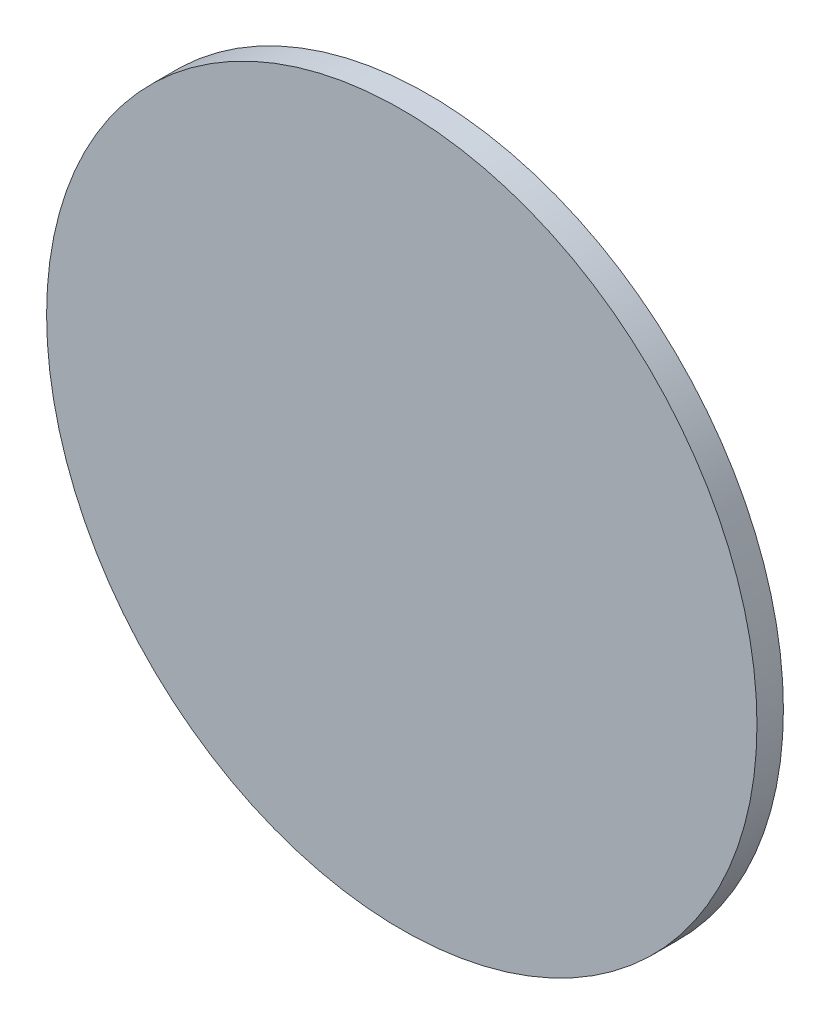
ISO-10303-21;
HEADER;
FILE_DESCRIPTION(('STEP AP214'),'2;1');
FILE_NAME('part.step','',(''),(''),'','','');
FILE_SCHEMA(('AUTOMOTIVE_DESIGN { 1 0 10303 214 1 1 1 1 }'));
ENDSEC;
DATA;
#1=APPLICATION_CONTEXT('core data for automotive mechanical design processes');
#2=APPLICATION_PROTOCOL_DEFINITION('international standard','automotive_design',2000,#1);
#3=PRODUCT_CONTEXT('',#1,'mechanical');
#4=PRODUCT('Part','Part','',(#3));
#5=PRODUCT_RELATED_PRODUCT_CATEGORY('part','',(#4));
#6=PRODUCT_DEFINITION_FORMATION('','',#4);
#7=PRODUCT_DEFINITION_CONTEXT('part definition',#1,'design');
#8=PRODUCT_DEFINITION('design','',#6,#7);
#9=PRODUCT_DEFINITION_SHAPE('','',#8);
#10=(LENGTH_UNIT() NAMED_UNIT(*) SI_UNIT(.MILLI.,.METRE.));
#11=(NAMED_UNIT(*) PLANE_ANGLE_UNIT() SI_UNIT($,.RADIAN.));
#12=(NAMED_UNIT(*) SI_UNIT($,.STERADIAN.) SOLID_ANGLE_UNIT());
#13=UNCERTAINTY_MEASURE_WITH_UNIT(LENGTH_MEASURE(1.E-05),#10,'distance_accuracy_value','');
#14=(GEOMETRIC_REPRESENTATION_CONTEXT(3) GLOBAL_UNCERTAINTY_ASSIGNED_CONTEXT((#13)) GLOBAL_UNIT_ASSIGNED_CONTEXT((#10,
#11,#12)) REPRESENTATION_CONTEXT('',''));
#15=CARTESIAN_POINT('',(0.,0.,0.));
#16=DIRECTION('',(0.,0.,1.));
#17=DIRECTION('',(1.,0.,0.));
#18=AXIS2_PLACEMENT_3D('',#15,#16,#17);
#19=CARTESIAN_POINT('',(-2.5,-2.5,60.1));
#20=DIRECTION('',(0.,0.,1.));
#21=DIRECTION('',(1.,0.,0.));
#22=AXIS2_PLACEMENT_3D('',#19,#20,#21);
#23=PLANE('',#22);
#24=DIRECTION('',(1.,0.,0.));
#25=VECTOR('',#24,1.);
#26=CARTESIAN_POINT('',(-2.5,2.5,60.1));
#27=LINE('',#26,#25);
#28=CARTESIAN_POINT('',(-2.5,2.5,60.1));
#29=VERTEX_POINT('',#28);
#30=CARTESIAN_POINT('',(2.5,2.5,60.1));
#31=VERTEX_POINT('',#30);
#32=EDGE_CURVE('E9',#29,#31,#27,.T.);
#33=ORIENTED_EDGE('',*,*,#32,.T.);
#34=DIRECTION('',(0.,1.,0.));
#35=VECTOR('',#34,1.);
#36=CARTESIAN_POINT('',(2.5,-2.5,60.1));
#37=LINE('',#36,#35);
#38=CARTESIAN_POINT('',(2.5,-2.5,60.1));
#39=VERTEX_POINT('',#38);
#40=EDGE_CURVE('E45',#39,#31,#37,.T.);
#41=ORIENTED_EDGE('',*,*,#40,.F.);
#42=DIRECTION('',(1.,0.,0.));
#43=VECTOR('',#42,1.);
#44=CARTESIAN_POINT('',(-2.5,-2.5,60.1));
#45=LINE('',#44,#43);
#46=CARTESIAN_POINT('',(-2.5,-2.5,60.1));
#47=VERTEX_POINT('',#46);
#48=EDGE_CURVE('E18',#47,#39,#45,.T.);
#49=ORIENTED_EDGE('',*,*,#48,.F.);
#50=DIRECTION('',(0.,1.,0.));
#51=VECTOR('',#50,1.);
#52=CARTESIAN_POINT('',(-2.5,-2.5,60.1));
#53=LINE('',#52,#51);
#54=EDGE_CURVE('E102',#47,#29,#53,.T.);
#55=ORIENTED_EDGE('',*,*,#54,.T.);
#56=EDGE_LOOP('',(#33,#41,#49,#55));
#57=FACE_BOUND('',#56,.T.);
#58=ADVANCED_FACE('F15',(#57),#23,.F.);
#59=CARTESIAN_POINT('',(-2.5,2.5,60.1));
#60=DIRECTION('',(0.,1.,0.));
#61=DIRECTION('',(1.,0.,0.));
#62=AXIS2_PLACEMENT_3D('',#59,#60,#61);
#63=PLANE('',#62);
#64=ORIENTED_EDGE('',*,*,#32,.F.);
#65=DIRECTION('',(0.,0.,1.));
#66=VECTOR('',#65,1.);
#67=CARTESIAN_POINT('',(-2.5,2.5,60.1));
#68=LINE('',#67,#66);
#69=CARTESIAN_POINT('',(-2.5,2.5,61.));
#70=VERTEX_POINT('',#69);
#71=EDGE_CURVE('E101',#29,#70,#68,.T.);
#72=ORIENTED_EDGE('',*,*,#71,.T.);
#73=DIRECTION('',(1.,0.,0.));
#74=VECTOR('',#73,1.);
#75=CARTESIAN_POINT('',(-2.5,2.5,61.));
#76=LINE('',#75,#74);
#77=CARTESIAN_POINT('',(2.5,2.5,61.));
#78=VERTEX_POINT('',#77);
#79=EDGE_CURVE('E106',#70,#78,#76,.T.);
#80=ORIENTED_EDGE('',*,*,#79,.T.);
#81=DIRECTION('',(0.,0.,1.));
#82=VECTOR('',#81,1.);
#83=CARTESIAN_POINT('',(2.5,2.5,60.1));
#84=LINE('',#83,#82);
#85=EDGE_CURVE('E24',#31,#78,#84,.T.);
#86=ORIENTED_EDGE('',*,*,#85,.F.);
#87=EDGE_LOOP('',(#64,#72,#80,#86));
#88=FACE_BOUND('',#87,.T.);
#89=ADVANCED_FACE('F148',(#88),#63,.T.);
#90=CARTESIAN_POINT('',(2.5,-2.5,60.1));
#91=DIRECTION('',(1.,0.,0.));
#92=DIRECTION('',(0.,1.,0.));
#93=AXIS2_PLACEMENT_3D('',#90,#91,#92);
#94=PLANE('',#93);
#95=DIRECTION('',(0.,0.,1.));
#96=VECTOR('',#95,1.);
#97=CARTESIAN_POINT('',(2.5,-2.5,60.1));
#98=LINE('',#97,#96);
#99=CARTESIAN_POINT('',(2.5,-2.5,61.));
#100=VERTEX_POINT('',#99);
#101=EDGE_CURVE('E118',#39,#100,#98,.T.);
#102=ORIENTED_EDGE('',*,*,#101,.F.);
#103=ORIENTED_EDGE('',*,*,#40,.T.);
#104=ORIENTED_EDGE('',*,*,#85,.T.);
#105=DIRECTION('',(0.,1.,0.));
#106=VECTOR('',#105,1.);
#107=CARTESIAN_POINT('',(2.5,-2.5,61.));
#108=LINE('',#107,#106);
#109=EDGE_CURVE('E95',#100,#78,#108,.T.);
#110=ORIENTED_EDGE('',*,*,#109,.F.);
#111=EDGE_LOOP('',(#102,#103,#104,#110));
#112=FACE_BOUND('',#111,.T.);
#113=ADVANCED_FACE('F132',(#112),#94,.T.);
#114=CARTESIAN_POINT('',(-2.5,-2.5,60.1));
#115=DIRECTION('',(0.,1.,0.));
#116=DIRECTION('',(1.,0.,0.));
#117=AXIS2_PLACEMENT_3D('',#114,#115,#116);
#118=PLANE('',#117);
#119=ORIENTED_EDGE('',*,*,#101,.T.);
#120=DIRECTION('',(1.,0.,0.));
#121=VECTOR('',#120,1.);
#122=CARTESIAN_POINT('',(-2.5,-2.5,61.));
#123=LINE('',#122,#121);
#124=CARTESIAN_POINT('',(-2.5,-2.5,61.));
#125=VERTEX_POINT('',#124);
#126=EDGE_CURVE('E100',#125,#100,#123,.T.);
#127=ORIENTED_EDGE('',*,*,#126,.F.);
#128=DIRECTION('',(0.,0.,1.));
#129=VECTOR('',#128,1.);
#130=CARTESIAN_POINT('',(-2.5,-2.5,60.1));
#131=LINE('',#130,#129);
#132=EDGE_CURVE('E116',#47,#125,#131,.T.);
#133=ORIENTED_EDGE('',*,*,#132,.F.);
#134=ORIENTED_EDGE('',*,*,#48,.T.);
#135=EDGE_LOOP('',(#119,#127,#133,#134));
#136=FACE_BOUND('',#135,.T.);
#137=ADVANCED_FACE('F139',(#136),#118,.F.);
#138=CARTESIAN_POINT('',(-2.5,-2.5,60.1));
#139=DIRECTION('',(1.,0.,0.));
#140=DIRECTION('',(0.,1.,0.));
#141=AXIS2_PLACEMENT_3D('',#138,#139,#140);
#142=PLANE('',#141);
#143=DIRECTION('',(0.,1.,0.));
#144=VECTOR('',#143,1.);
#145=CARTESIAN_POINT('',(-2.5,-2.5,61.));
#146=LINE('',#145,#144);
#147=EDGE_CURVE('E104',#125,#70,#146,.T.);
#148=ORIENTED_EDGE('',*,*,#147,.T.);
#149=ORIENTED_EDGE('',*,*,#71,.F.);
#150=ORIENTED_EDGE('',*,*,#54,.F.);
#151=ORIENTED_EDGE('',*,*,#132,.T.);
#152=EDGE_LOOP('',(#148,#149,#150,#151));
#153=FACE_BOUND('',#152,.T.);
#154=ADVANCED_FACE('F145',(#153),#142,.F.);
#155=CARTESIAN_POINT('',(0.,0.,61.));
#156=DIRECTION('',(0.,0.,1.));
#157=DIRECTION('',(1.,0.,0.));
#158=AXIS2_PLACEMENT_3D('',#155,#156,#157);
#159=PLANE('',#158);
#160=ORIENTED_EDGE('',*,*,#126,.T.);
#161=ORIENTED_EDGE('',*,*,#109,.T.);
#162=ORIENTED_EDGE('',*,*,#79,.F.);
#163=ORIENTED_EDGE('',*,*,#147,.F.);
#164=EDGE_LOOP('',(#160,#161,#162,#163));
#165=FACE_BOUND('',#164,.T.);
#166=CARTESIAN_POINT('',(0.,0.,61.));
#167=DIRECTION('',(0.,0.,1.));
#168=DIRECTION('',(1.,0.,0.));
#169=AXIS2_PLACEMENT_3D('',#166,#167,#168);
#170=CIRCLE('',#169,21.5);
#171=CARTESIAN_POINT('',(21.5,0.,61.));
#172=VERTEX_POINT('',#171);
#173=EDGE_CURVE('E85',#172,#172,#170,.T.);
#174=ORIENTED_EDGE('',*,*,#173,.F.);
#175=EDGE_LOOP('',(#174));
#176=FACE_BOUND('',#175,.T.);
#177=ADVANCED_FACE('F138',(#165,#176),#159,.F.);
#178=CARTESIAN_POINT('',(0.,0.,62.6));
#179=DIRECTION('',(0.,0.,1.));
#180=DIRECTION('',(1.,0.,0.));
#181=AXIS2_PLACEMENT_3D('',#178,#179,#180);
#182=PLANE('',#181);
#183=CARTESIAN_POINT('',(0.,0.,62.6));
#184=DIRECTION('',(0.,0.,1.));
#185=DIRECTION('',(1.,0.,0.));
#186=AXIS2_PLACEMENT_3D('',#183,#184,#185);
#187=CIRCLE('',#186,21.5);
#188=CARTESIAN_POINT('',(21.5,0.,62.6));
#189=VERTEX_POINT('',#188);
#190=EDGE_CURVE('E79',#189,#189,#187,.T.);
#191=ORIENTED_EDGE('',*,*,#190,.T.);
#192=EDGE_LOOP('',(#191));
#193=FACE_BOUND('',#192,.T.);
#194=ADVANCED_FACE('F88',(#193),#182,.T.);
#195=CARTESIAN_POINT('',(0.,0.,61.));
#196=DIRECTION('',(0.,0.,1.));
#197=DIRECTION('',(1.,0.,0.));
#198=AXIS2_PLACEMENT_3D('',#195,#196,#197);
#199=CYLINDRICAL_SURFACE('',#198,21.5);
#200=ORIENTED_EDGE('',*,*,#190,.F.);
#201=DIRECTION('',(0.,0.,1.));
#202=VECTOR('',#201,1.);
#203=CARTESIAN_POINT('',(21.5,0.,61.));
#204=LINE('',#203,#202);
#205=EDGE_CURVE('E80',#172,#189,#204,.T.);
#206=ORIENTED_EDGE('',*,*,#205,.F.);
#207=ORIENTED_EDGE('',*,*,#173,.T.);
#208=ORIENTED_EDGE('',*,*,#205,.T.);
#209=EDGE_LOOP('',(#200,#206,#207,#208));
#210=FACE_BOUND('',#209,.T.);
#211=ADVANCED_FACE('F78',(#210),#199,.T.);
#212=CLOSED_SHELL('',(#58,#89,#113,#137,#154,#177,#194,#211));
#213=MANIFOLD_SOLID_BREP('B1',#212);
#214=ADVANCED_BREP_SHAPE_REPRESENTATION('',(#18,#213),#14);
#215=SHAPE_DEFINITION_REPRESENTATION(#9,#214);
ENDSEC;
END-ISO-10303-21;
